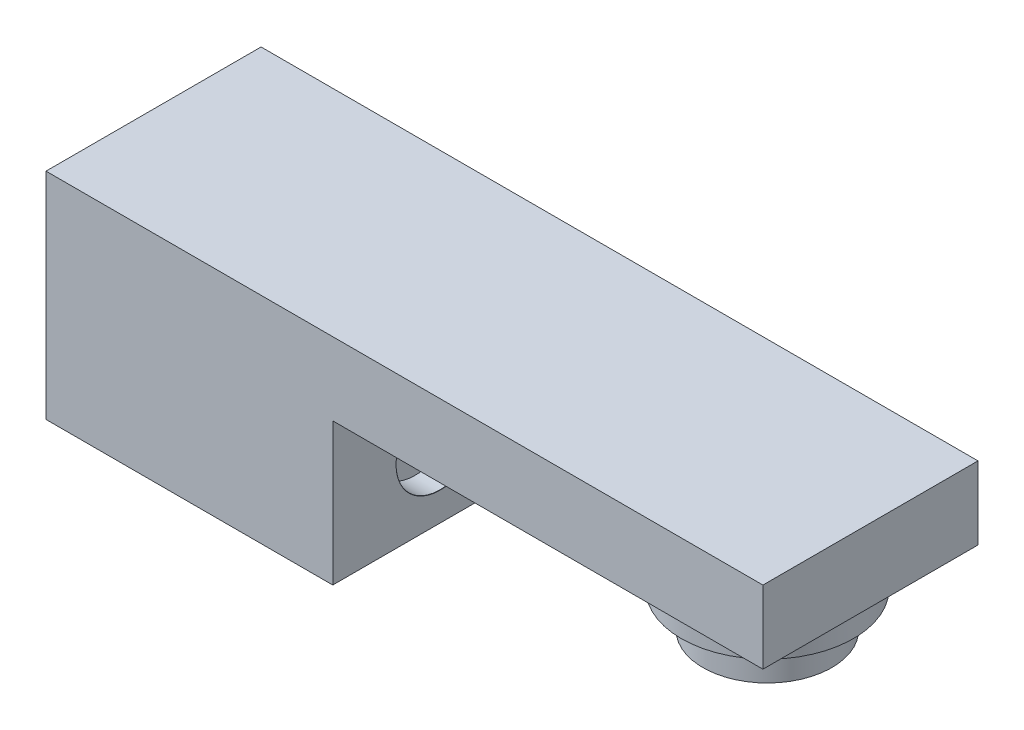
ISO-10303-21;
HEADER;
FILE_DESCRIPTION(('STEP AP214'),'2;1');
FILE_NAME('part.step','',(''),(''),'','','');
FILE_SCHEMA(('AUTOMOTIVE_DESIGN { 1 0 10303 214 1 1 1 1 }'));
ENDSEC;
DATA;
#1=APPLICATION_CONTEXT('core data for automotive mechanical design processes');
#2=APPLICATION_PROTOCOL_DEFINITION('international standard','automotive_design',2000,#1);
#3=PRODUCT_CONTEXT('',#1,'mechanical');
#4=PRODUCT('Part','Part','',(#3));
#5=PRODUCT_RELATED_PRODUCT_CATEGORY('part','',(#4));
#6=PRODUCT_DEFINITION_FORMATION('','',#4);
#7=PRODUCT_DEFINITION_CONTEXT('part definition',#1,'design');
#8=PRODUCT_DEFINITION('design','',#6,#7);
#9=PRODUCT_DEFINITION_SHAPE('','',#8);
#10=(LENGTH_UNIT() NAMED_UNIT(*) SI_UNIT(.MILLI.,.METRE.));
#11=(NAMED_UNIT(*) PLANE_ANGLE_UNIT() SI_UNIT($,.RADIAN.));
#12=(NAMED_UNIT(*) SI_UNIT($,.STERADIAN.) SOLID_ANGLE_UNIT());
#13=UNCERTAINTY_MEASURE_WITH_UNIT(LENGTH_MEASURE(1.E-05),#10,'distance_accuracy_value','');
#14=(GEOMETRIC_REPRESENTATION_CONTEXT(3) GLOBAL_UNCERTAINTY_ASSIGNED_CONTEXT((#13)) GLOBAL_UNIT_ASSIGNED_CONTEXT((#10,
#11,#12)) REPRESENTATION_CONTEXT('',''));
#15=CARTESIAN_POINT('',(0.,0.,0.));
#16=DIRECTION('',(0.,0.,1.));
#17=DIRECTION('',(1.,0.,0.));
#18=AXIS2_PLACEMENT_3D('',#15,#16,#17);
#19=CARTESIAN_POINT('',(40.,0.,0.));
#20=DIRECTION('',(-1.,0.,0.));
#21=DIRECTION('',(0.,0.,1.));
#22=AXIS2_PLACEMENT_3D('',#19,#20,#21);
#23=PLANE('',#22);
#24=CARTESIAN_POINT('',(40.,2.48247175305494,24.681970174111));
#25=DIRECTION('',(1.,0.,0.));
#26=DIRECTION('',(0.,0.,-1.));
#27=AXIS2_PLACEMENT_3D('',#24,#25,#26);
#28=CIRCLE('',#27,6.144);
#29=CARTESIAN_POINT('',(40.,2.48247175305494,18.537970174111));
#30=VERTEX_POINT('',#29);
#31=EDGE_CURVE('E236',#30,#30,#28,.T.);
#32=ORIENTED_EDGE('',*,*,#31,.F.);
#33=EDGE_LOOP('',(#32));
#34=FACE_BOUND('',#33,.T.);
#35=DIRECTION('',(0.,0.,-1.));
#36=VECTOR('',#35,1.);
#37=CARTESIAN_POINT('',(40.,12.1952160658731,39.6578468441171));
#38=LINE('',#37,#36);
#39=CARTESIAN_POINT('',(40.,12.1952160658731,39.6578468441171));
#40=VERTEX_POINT('',#39);
#41=CARTESIAN_POINT('',(40.,12.1952160658731,9.65784684411711));
#42=VERTEX_POINT('',#41);
#43=EDGE_CURVE('E49',#40,#42,#38,.T.);
#44=ORIENTED_EDGE('',*,*,#43,.F.);
#45=DIRECTION('',(0.,-1.,0.));
#46=VECTOR('',#45,1.);
#47=CARTESIAN_POINT('',(40.,-7.63901148226845,39.6578468441171));
#48=LINE('',#47,#46);
#49=CARTESIAN_POINT('',(40.,-7.63901148226845,39.6578468441171));
#50=VERTEX_POINT('',#49);
#51=EDGE_CURVE('E86',#40,#50,#48,.T.);
#52=ORIENTED_EDGE('',*,*,#51,.T.);
#53=DIRECTION('',(0.,0.,-1.));
#54=VECTOR('',#53,1.);
#55=CARTESIAN_POINT('',(40.,-7.63901148226845,39.6578468441171));
#56=LINE('',#55,#54);
#57=CARTESIAN_POINT('',(40.,-7.63901148226845,9.65784684411711));
#58=VERTEX_POINT('',#57);
#59=EDGE_CURVE('E55',#50,#58,#56,.T.);
#60=ORIENTED_EDGE('',*,*,#59,.T.);
#61=DIRECTION('',(0.,1.,0.));
#62=VECTOR('',#61,1.);
#63=CARTESIAN_POINT('',(40.,-7.63901148226845,9.65784684411711));
#64=LINE('',#63,#62);
#65=EDGE_CURVE('E97',#58,#42,#64,.T.);
#66=ORIENTED_EDGE('',*,*,#65,.T.);
#67=EDGE_LOOP('',(#44,#52,#60,#66));
#68=FACE_BOUND('',#67,.T.);
#69=ADVANCED_FACE('F34',(#34,#68),#23,.F.);
#70=CARTESIAN_POINT('',(40.,-7.63901148226845,39.6578468441171));
#71=DIRECTION('',(0.,0.,-1.));
#72=DIRECTION('',(-1.,0.,0.));
#73=AXIS2_PLACEMENT_3D('',#70,#71,#72);
#74=PLANE('',#73);
#75=DIRECTION('',(0.,-1.,0.));
#76=VECTOR('',#75,1.);
#77=CARTESIAN_POINT('',(0.,-7.63901148226845,39.6578468441171));
#78=LINE('',#77,#76);
#79=CARTESIAN_POINT('',(0.,22.3609885177315,39.6578468441171));
#80=VERTEX_POINT('',#79);
#81=CARTESIAN_POINT('',(0.,-7.63901148226845,39.6578468441171));
#82=VERTEX_POINT('',#81);
#83=EDGE_CURVE('E93',#80,#82,#78,.T.);
#84=ORIENTED_EDGE('',*,*,#83,.T.);
#85=DIRECTION('',(-1.,0.,0.));
#86=VECTOR('',#85,1.);
#87=CARTESIAN_POINT('',(40.,-7.63901148226845,39.6578468441171));
#88=LINE('',#87,#86);
#89=EDGE_CURVE('E42',#50,#82,#88,.T.);
#90=ORIENTED_EDGE('',*,*,#89,.F.);
#91=ORIENTED_EDGE('',*,*,#51,.F.);
#92=DIRECTION('',(-1.,0.,0.));
#93=VECTOR('',#92,1.);
#94=CARTESIAN_POINT('',(100.,12.1952160658731,39.6578468441171));
#95=LINE('',#94,#93);
#96=CARTESIAN_POINT('',(100.,12.1952160658731,39.6578468441171));
#97=VERTEX_POINT('',#96);
#98=EDGE_CURVE('E102',#97,#40,#95,.T.);
#99=ORIENTED_EDGE('',*,*,#98,.F.);
#100=DIRECTION('',(0.,-1.,0.));
#101=VECTOR('',#100,1.);
#102=CARTESIAN_POINT('',(100.,22.3609885177315,39.6578468441171));
#103=LINE('',#102,#101);
#104=CARTESIAN_POINT('',(100.,22.3609885177315,39.6578468441171));
#105=VERTEX_POINT('',#104);
#106=EDGE_CURVE('E96',#105,#97,#103,.T.);
#107=ORIENTED_EDGE('',*,*,#106,.F.);
#108=DIRECTION('',(-1.,0.,0.));
#109=VECTOR('',#108,1.);
#110=CARTESIAN_POINT('',(40.,22.3609885177315,39.6578468441171));
#111=LINE('',#110,#109);
#112=EDGE_CURVE('E79',#105,#80,#111,.T.);
#113=ORIENTED_EDGE('',*,*,#112,.T.);
#114=EDGE_LOOP('',(#84,#90,#91,#99,#107,#113));
#115=FACE_BOUND('',#114,.T.);
#116=ADVANCED_FACE('F36',(#115),#74,.F.);
#117=CARTESIAN_POINT('',(40.,-7.63901148226845,39.6578468441171));
#118=DIRECTION('',(0.,1.,0.));
#119=DIRECTION('',(0.,0.,1.));
#120=AXIS2_PLACEMENT_3D('',#117,#118,#119);
#121=PLANE('',#120);
#122=DIRECTION('',(0.,0.,-1.));
#123=VECTOR('',#122,1.);
#124=CARTESIAN_POINT('',(0.,-7.63901148226845,39.6578468441171));
#125=LINE('',#124,#123);
#126=CARTESIAN_POINT('',(0.,-7.63901148226845,9.65784684411711));
#127=VERTEX_POINT('',#126);
#128=EDGE_CURVE('E100',#82,#127,#125,.T.);
#129=ORIENTED_EDGE('',*,*,#128,.T.);
#130=DIRECTION('',(-1.,0.,0.));
#131=VECTOR('',#130,1.);
#132=CARTESIAN_POINT('',(40.,-7.63901148226845,9.65784684411711));
#133=LINE('',#132,#131);
#134=EDGE_CURVE('E113',#58,#127,#133,.T.);
#135=ORIENTED_EDGE('',*,*,#134,.F.);
#136=ORIENTED_EDGE('',*,*,#59,.F.);
#137=ORIENTED_EDGE('',*,*,#89,.T.);
#138=EDGE_LOOP('',(#129,#135,#136,#137));
#139=FACE_BOUND('',#138,.T.);
#140=ADVANCED_FACE('F116',(#139),#121,.F.);
#141=CARTESIAN_POINT('',(40.,-7.63901148226845,9.65784684411711));
#142=DIRECTION('',(0.,0.,1.));
#143=DIRECTION('',(1.,0.,0.));
#144=AXIS2_PLACEMENT_3D('',#141,#142,#143);
#145=PLANE('',#144);
#146=DIRECTION('',(0.,1.,0.));
#147=VECTOR('',#146,1.);
#148=CARTESIAN_POINT('',(0.,-7.63901148226845,9.65784684411711));
#149=LINE('',#148,#147);
#150=CARTESIAN_POINT('',(0.,22.3609885177315,9.65784684411711));
#151=VERTEX_POINT('',#150);
#152=EDGE_CURVE('E87',#127,#151,#149,.T.);
#153=ORIENTED_EDGE('',*,*,#152,.T.);
#154=DIRECTION('',(-1.,0.,0.));
#155=VECTOR('',#154,1.);
#156=CARTESIAN_POINT('',(40.,22.3609885177315,9.65784684411711));
#157=LINE('',#156,#155);
#158=CARTESIAN_POINT('',(100.,22.3609885177315,9.65784684411711));
#159=VERTEX_POINT('',#158);
#160=EDGE_CURVE('E82',#159,#151,#157,.T.);
#161=ORIENTED_EDGE('',*,*,#160,.F.);
#162=DIRECTION('',(0.,1.,0.));
#163=VECTOR('',#162,1.);
#164=CARTESIAN_POINT('',(100.,22.3609885177315,9.65784684411711));
#165=LINE('',#164,#163);
#166=CARTESIAN_POINT('',(100.,12.1952160658731,9.65784684411711));
#167=VERTEX_POINT('',#166);
#168=EDGE_CURVE('E132',#167,#159,#165,.T.);
#169=ORIENTED_EDGE('',*,*,#168,.F.);
#170=DIRECTION('',(-1.,0.,0.));
#171=VECTOR('',#170,1.);
#172=CARTESIAN_POINT('',(100.,12.1952160658731,9.65784684411711));
#173=LINE('',#172,#171);
#174=EDGE_CURVE('E106',#167,#42,#173,.T.);
#175=ORIENTED_EDGE('',*,*,#174,.T.);
#176=ORIENTED_EDGE('',*,*,#65,.F.);
#177=ORIENTED_EDGE('',*,*,#134,.T.);
#178=EDGE_LOOP('',(#153,#161,#169,#175,#176,#177));
#179=FACE_BOUND('',#178,.T.);
#180=ADVANCED_FACE('F146',(#179),#145,.F.);
#181=CARTESIAN_POINT('',(40.,22.3609885177315,39.6578468441171));
#182=DIRECTION('',(0.,-1.,0.));
#183=DIRECTION('',(0.,0.,-1.));
#184=AXIS2_PLACEMENT_3D('',#181,#182,#183);
#185=PLANE('',#184);
#186=DIRECTION('',(0.,0.,1.));
#187=VECTOR('',#186,1.);
#188=CARTESIAN_POINT('',(0.,22.3609885177315,39.6578468441171));
#189=LINE('',#188,#187);
#190=EDGE_CURVE('E75',#151,#80,#189,.T.);
#191=ORIENTED_EDGE('',*,*,#190,.T.);
#192=ORIENTED_EDGE('',*,*,#112,.F.);
#193=DIRECTION('',(0.,0.,1.));
#194=VECTOR('',#193,1.);
#195=CARTESIAN_POINT('',(100.,22.3609885177315,39.6578468441171));
#196=LINE('',#195,#194);
#197=EDGE_CURVE('E135',#159,#105,#196,.T.);
#198=ORIENTED_EDGE('',*,*,#197,.F.);
#199=ORIENTED_EDGE('',*,*,#160,.T.);
#200=EDGE_LOOP('',(#191,#192,#198,#199));
#201=FACE_BOUND('',#200,.T.);
#202=ADVANCED_FACE('F77',(#201),#185,.F.);
#203=CARTESIAN_POINT('',(0.,0.,0.));
#204=DIRECTION('',(-1.,0.,0.));
#205=DIRECTION('',(0.,0.,1.));
#206=AXIS2_PLACEMENT_3D('',#203,#204,#205);
#207=PLANE('',#206);
#208=CARTESIAN_POINT('',(0.,2.48247175305494,24.681970174111));
#209=DIRECTION('',(1.,0.,0.));
#210=DIRECTION('',(0.,0.,-1.));
#211=AXIS2_PLACEMENT_3D('',#208,#209,#210);
#212=CIRCLE('',#211,2.74999999999999);
#213=CARTESIAN_POINT('',(0.,2.48247175305494,21.931970174111));
#214=VERTEX_POINT('',#213);
#215=EDGE_CURVE('E176',#214,#214,#212,.T.);
#216=ORIENTED_EDGE('',*,*,#215,.T.);
#217=EDGE_LOOP('',(#216));
#218=FACE_BOUND('',#217,.T.);
#219=ORIENTED_EDGE('',*,*,#83,.F.);
#220=ORIENTED_EDGE('',*,*,#190,.F.);
#221=ORIENTED_EDGE('',*,*,#152,.F.);
#222=ORIENTED_EDGE('',*,*,#128,.F.);
#223=EDGE_LOOP('',(#219,#220,#221,#222));
#224=FACE_BOUND('',#223,.T.);
#225=ADVANCED_FACE('F99',(#218,#224),#207,.T.);
#226=CARTESIAN_POINT('',(100.,12.1952160658731,39.6578468441171));
#227=DIRECTION('',(0.,1.,0.));
#228=DIRECTION('',(0.,0.,1.));
#229=AXIS2_PLACEMENT_3D('',#226,#227,#228);
#230=PLANE('',#229);
#231=CARTESIAN_POINT('',(85.6202343826868,12.1952160658731,24.6578468441171));
#232=DIRECTION('',(0.,1.,0.));
#233=DIRECTION('',(0.,0.,1.));
#234=AXIS2_PLACEMENT_3D('',#231,#232,#233);
#235=CIRCLE('',#234,12.);
#236=CARTESIAN_POINT('',(85.6202343826868,12.1952160658731,36.6578468441171));
#237=VERTEX_POINT('',#236);
#238=EDGE_CURVE('E11',#237,#237,#235,.F.);
#239=ORIENTED_EDGE('',*,*,#238,.F.);
#240=EDGE_LOOP('',(#239));
#241=FACE_BOUND('',#240,.T.);
#242=ORIENTED_EDGE('',*,*,#43,.T.);
#243=ORIENTED_EDGE('',*,*,#174,.F.);
#244=DIRECTION('',(0.,0.,-1.));
#245=VECTOR('',#244,1.);
#246=CARTESIAN_POINT('',(100.,12.1952160658731,39.6578468441171));
#247=LINE('',#246,#245);
#248=EDGE_CURVE('E126',#97,#167,#247,.T.);
#249=ORIENTED_EDGE('',*,*,#248,.F.);
#250=ORIENTED_EDGE('',*,*,#98,.T.);
#251=EDGE_LOOP('',(#242,#243,#249,#250));
#252=FACE_BOUND('',#251,.T.);
#253=ADVANCED_FACE('F121',(#241,#252),#230,.F.);
#254=CARTESIAN_POINT('',(100.,0.,0.));
#255=DIRECTION('',(1.,0.,0.));
#256=DIRECTION('',(0.,0.,-1.));
#257=AXIS2_PLACEMENT_3D('',#254,#255,#256);
#258=PLANE('',#257);
#259=ORIENTED_EDGE('',*,*,#106,.T.);
#260=ORIENTED_EDGE('',*,*,#248,.T.);
#261=ORIENTED_EDGE('',*,*,#168,.T.);
#262=ORIENTED_EDGE('',*,*,#197,.T.);
#263=EDGE_LOOP('',(#259,#260,#261,#262));
#264=FACE_BOUND('',#263,.T.);
#265=ADVANCED_FACE('F134',(#264),#258,.T.);
#266=CARTESIAN_POINT('',(85.6202343826868,7.19521606587315,24.6578468441171));
#267=DIRECTION('',(0.,1.,0.));
#268=DIRECTION('',(0.,0.,1.));
#269=AXIS2_PLACEMENT_3D('',#266,#267,#268);
#270=CYLINDRICAL_SURFACE('',#269,12.);
#271=CARTESIAN_POINT('',(85.6202343826868,7.19521606587315,24.6578468441171));
#272=DIRECTION('',(0.,-1.,0.));
#273=DIRECTION('',(0.,0.,-1.));
#274=AXIS2_PLACEMENT_3D('',#271,#272,#273);
#275=CIRCLE('',#274,12.);
#276=CARTESIAN_POINT('',(85.6202343826868,7.19521606587315,12.6578468441171));
#277=VERTEX_POINT('',#276);
#278=EDGE_CURVE('E137',#277,#277,#275,.T.);
#279=ORIENTED_EDGE('',*,*,#278,.F.);
#280=EDGE_LOOP('',(#279));
#281=FACE_BOUND('',#280,.T.);
#282=ORIENTED_EDGE('',*,*,#238,.T.);
#283=EDGE_LOOP('',(#282));
#284=FACE_BOUND('',#283,.T.);
#285=ADVANCED_FACE('F196',(#281,#284),#270,.T.);
#286=CARTESIAN_POINT('',(85.6202343826868,7.19521606587315,24.6578468441171));
#287=DIRECTION('',(0.,-1.,0.));
#288=DIRECTION('',(0.,0.,-1.));
#289=AXIS2_PLACEMENT_3D('',#286,#287,#288);
#290=PLANE('',#289);
#291=CARTESIAN_POINT('',(85.6202343826868,7.19521606587315,24.6578468441171));
#292=DIRECTION('',(0.,-1.,0.));
#293=DIRECTION('',(0.,0.,-1.));
#294=AXIS2_PLACEMENT_3D('',#291,#292,#293);
#295=CIRCLE('',#294,9.);
#296=CARTESIAN_POINT('',(85.6202343826868,7.19521606587315,15.6578468441171));
#297=VERTEX_POINT('',#296);
#298=EDGE_CURVE('E178',#297,#297,#295,.T.);
#299=ORIENTED_EDGE('',*,*,#298,.F.);
#300=EDGE_LOOP('',(#299));
#301=FACE_BOUND('',#300,.T.);
#302=ORIENTED_EDGE('',*,*,#278,.T.);
#303=EDGE_LOOP('',(#302));
#304=FACE_BOUND('',#303,.T.);
#305=ADVANCED_FACE('F194',(#301,#304),#290,.T.);
#306=CARTESIAN_POINT('',(85.6202343826868,2.19521606587315,24.6578468441171));
#307=DIRECTION('',(0.,1.,0.));
#308=DIRECTION('',(0.,0.,1.));
#309=AXIS2_PLACEMENT_3D('',#306,#307,#308);
#310=CYLINDRICAL_SURFACE('',#309,9.);
#311=CARTESIAN_POINT('',(85.6202343826868,2.19521606587315,24.6578468441171));
#312=DIRECTION('',(0.,-1.,0.));
#313=DIRECTION('',(0.,0.,-1.));
#314=AXIS2_PLACEMENT_3D('',#311,#312,#313);
#315=CIRCLE('',#314,9.);
#316=CARTESIAN_POINT('',(85.6202343826868,2.19521606587315,15.6578468441171));
#317=VERTEX_POINT('',#316);
#318=EDGE_CURVE('E182',#317,#317,#315,.T.);
#319=ORIENTED_EDGE('',*,*,#318,.F.);
#320=EDGE_LOOP('',(#319));
#321=FACE_BOUND('',#320,.T.);
#322=ORIENTED_EDGE('',*,*,#298,.T.);
#323=EDGE_LOOP('',(#322));
#324=FACE_BOUND('',#323,.T.);
#325=ADVANCED_FACE('F205',(#321,#324),#310,.T.);
#326=CARTESIAN_POINT('',(85.6202343826868,2.19521606587315,24.6578468441171));
#327=DIRECTION('',(0.,-1.,0.));
#328=DIRECTION('',(0.,0.,-1.));
#329=AXIS2_PLACEMENT_3D('',#326,#327,#328);
#330=PLANE('',#329);
#331=ORIENTED_EDGE('',*,*,#318,.T.);
#332=EDGE_LOOP('',(#331));
#333=FACE_BOUND('',#332,.T.);
#334=ADVANCED_FACE('F211',(#333),#330,.T.);
#335=CARTESIAN_POINT('',(40.,2.48247175305494,24.681970174111));
#336=DIRECTION('',(1.,0.,0.));
#337=DIRECTION('',(0.,0.,-1.));
#338=AXIS2_PLACEMENT_3D('',#335,#336,#337);
#339=CYLINDRICAL_SURFACE('',#338,2.75);
#340=ORIENTED_EDGE('',*,*,#215,.F.);
#341=EDGE_LOOP('',(#340));
#342=FACE_BOUND('',#341,.T.);
#343=CARTESIAN_POINT('',(36.5,2.48247175305494,24.681970174111));
#344=DIRECTION('',(1.,0.,0.));
#345=DIRECTION('',(0.,0.,-1.));
#346=AXIS2_PLACEMENT_3D('',#343,#344,#345);
#347=CIRCLE('',#346,2.75);
#348=CARTESIAN_POINT('',(36.5,2.48247175305494,21.931970174111));
#349=VERTEX_POINT('',#348);
#350=EDGE_CURVE('E179',#349,#349,#347,.T.);
#351=ORIENTED_EDGE('',*,*,#350,.T.);
#352=EDGE_LOOP('',(#351));
#353=FACE_BOUND('',#352,.T.);
#354=ADVANCED_FACE('F215',(#342,#353),#339,.F.);
#355=CARTESIAN_POINT('',(36.5,8.60147175305494,24.681970174111));
#356=DIRECTION('',(-1.,0.,0.));
#357=DIRECTION('',(0.,0.,1.));
#358=AXIS2_PLACEMENT_3D('',#355,#356,#357);
#359=PLANE('',#358);
#360=ORIENTED_EDGE('',*,*,#350,.F.);
#361=EDGE_LOOP('',(#360));
#362=FACE_BOUND('',#361,.T.);
#363=CARTESIAN_POINT('',(36.5,2.48247175305494,24.681970174111));
#364=DIRECTION('',(1.,0.,0.));
#365=DIRECTION('',(0.,0.,-1.));
#366=AXIS2_PLACEMENT_3D('',#363,#364,#365);
#367=CIRCLE('',#366,6.119);
#368=CARTESIAN_POINT('',(36.5,2.48247175305494,18.562970174111));
#369=VERTEX_POINT('',#368);
#370=EDGE_CURVE('E184',#369,#369,#367,.T.);
#371=ORIENTED_EDGE('',*,*,#370,.T.);
#372=EDGE_LOOP('',(#371));
#373=FACE_BOUND('',#372,.T.);
#374=ADVANCED_FACE('F218',(#362,#373),#359,.F.);
#375=CARTESIAN_POINT('',(40.,2.48247175305494,24.681970174111));
#376=DIRECTION('',(1.,0.,0.));
#377=DIRECTION('',(0.,0.,-1.));
#378=AXIS2_PLACEMENT_3D('',#375,#376,#377);
#379=CYLINDRICAL_SURFACE('',#378,6.119);
#380=ORIENTED_EDGE('',*,*,#370,.F.);
#381=EDGE_LOOP('',(#380));
#382=FACE_BOUND('',#381,.T.);
#383=CARTESIAN_POINT('',(39.975,2.48247175305494,24.681970174111));
#384=DIRECTION('',(1.,0.,0.));
#385=DIRECTION('',(0.,0.,-1.));
#386=AXIS2_PLACEMENT_3D('',#383,#384,#385);
#387=CIRCLE('',#386,6.119);
#388=CARTESIAN_POINT('',(39.975,2.48247175305494,18.562970174111));
#389=VERTEX_POINT('',#388);
#390=EDGE_CURVE('E234',#389,#389,#387,.T.);
#391=ORIENTED_EDGE('',*,*,#390,.T.);
#392=EDGE_LOOP('',(#391));
#393=FACE_BOUND('',#392,.T.);
#394=ADVANCED_FACE('F221',(#382,#393),#379,.F.);
#395=CARTESIAN_POINT('',(40.,2.48247175305494,24.681970174111));
#396=DIRECTION('',(1.,0.,0.));
#397=DIRECTION('',(0.,0.,-1.));
#398=AXIS2_PLACEMENT_3D('',#395,#396,#397);
#399=CONICAL_SURFACE('',#398,6.144,0.785398163397448);
#400=ORIENTED_EDGE('',*,*,#390,.F.);
#401=EDGE_LOOP('',(#400));
#402=FACE_BOUND('',#401,.T.);
#403=ORIENTED_EDGE('',*,*,#31,.T.);
#404=EDGE_LOOP('',(#403));
#405=FACE_BOUND('',#404,.T.);
#406=ADVANCED_FACE('F225',(#402,#405),#399,.F.);
#407=CLOSED_SHELL('',(#69,#116,#140,#180,#202,#225,#253,#265,#285,#305,#325,#334,#354,#374,#394,#406));
#408=MANIFOLD_SOLID_BREP('B2',#407);
#409=ADVANCED_BREP_SHAPE_REPRESENTATION('',(#18,#408),#14);
#410=SHAPE_DEFINITION_REPRESENTATION(#9,#409);
ENDSEC;
END-ISO-10303-21;
